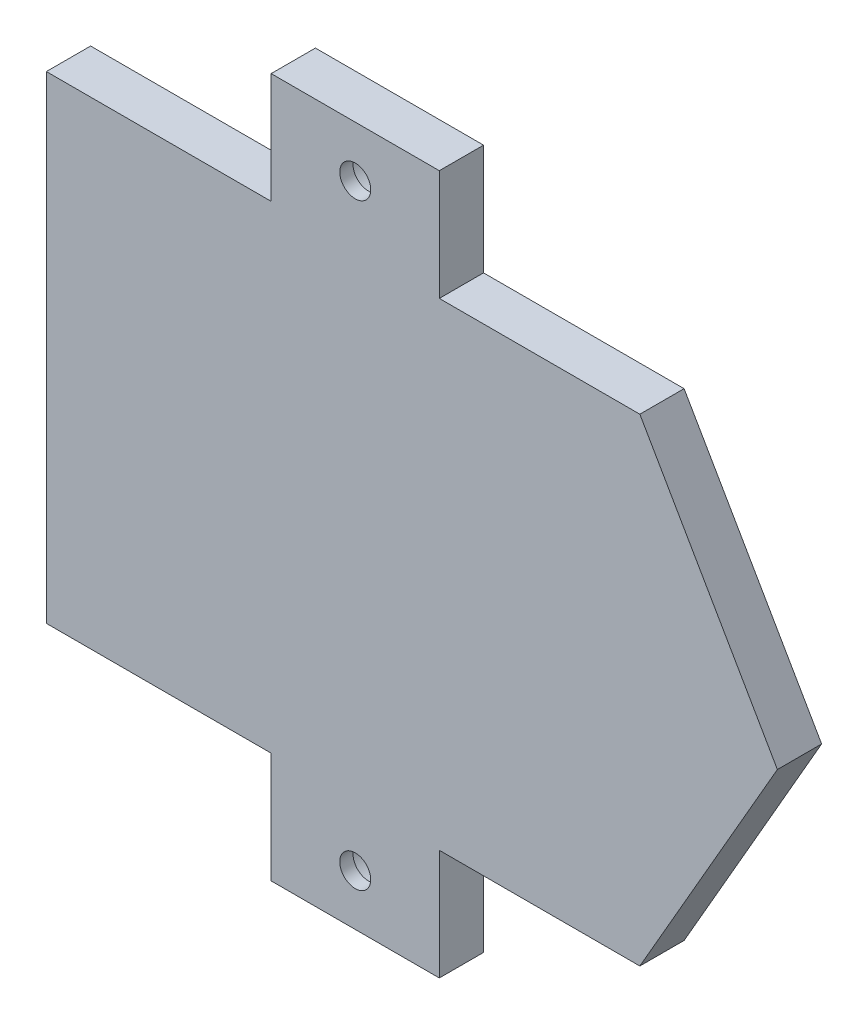
ISO-10303-21;
HEADER;
FILE_DESCRIPTION(('STEP AP214'),'2;1');
FILE_NAME('part.step','',(''),(''),'','','');
FILE_SCHEMA(('AUTOMOTIVE_DESIGN { 1 0 10303 214 1 1 1 1 }'));
ENDSEC;
DATA;
#1=APPLICATION_CONTEXT('core data for automotive mechanical design processes');
#2=APPLICATION_PROTOCOL_DEFINITION('international standard','automotive_design',2000,#1);
#3=PRODUCT_CONTEXT('',#1,'mechanical');
#4=PRODUCT('Part','Part','',(#3));
#5=PRODUCT_RELATED_PRODUCT_CATEGORY('part','',(#4));
#6=PRODUCT_DEFINITION_FORMATION('','',#4);
#7=PRODUCT_DEFINITION_CONTEXT('part definition',#1,'design');
#8=PRODUCT_DEFINITION('design','',#6,#7);
#9=PRODUCT_DEFINITION_SHAPE('','',#8);
#10=(LENGTH_UNIT() NAMED_UNIT(*) SI_UNIT(.MILLI.,.METRE.));
#11=(NAMED_UNIT(*) PLANE_ANGLE_UNIT() SI_UNIT($,.RADIAN.));
#12=(NAMED_UNIT(*) SI_UNIT($,.STERADIAN.) SOLID_ANGLE_UNIT());
#13=UNCERTAINTY_MEASURE_WITH_UNIT(LENGTH_MEASURE(1.E-05),#10,'distance_accuracy_value','');
#14=(GEOMETRIC_REPRESENTATION_CONTEXT(3) GLOBAL_UNCERTAINTY_ASSIGNED_CONTEXT((#13)) GLOBAL_UNIT_ASSIGNED_CONTEXT((#10,
#11,#12)) REPRESENTATION_CONTEXT('',''));
#15=CARTESIAN_POINT('',(0.,0.,0.));
#16=DIRECTION('',(0.,0.,1.));
#17=DIRECTION('',(1.,0.,0.));
#18=AXIS2_PLACEMENT_3D('',#15,#16,#17);
#19=CARTESIAN_POINT('',(0.,0.,0.));
#20=DIRECTION('',(0.,0.,1.));
#21=DIRECTION('',(1.,0.,0.));
#22=AXIS2_PLACEMENT_3D('',#19,#20,#21);
#23=PLANE('',#22);
#24=CARTESIAN_POINT('',(45.4000000000162,83.7499999999994,0.));
#25=DIRECTION('',(0.,0.,1.));
#26=DIRECTION('',(1.,0.,0.));
#27=AXIS2_PLACEMENT_3D('',#24,#25,#26);
#28=CIRCLE('',#27,3.5);
#29=CARTESIAN_POINT('',(41.9000000000162,83.7499999999994,0.));
#30=VERTEX_POINT('',#29);
#31=EDGE_CURVE('E294',#30,#30,#28,.T.);
#32=ORIENTED_EDGE('',*,*,#31,.T.);
#33=EDGE_LOOP('',(#32));
#34=FACE_BOUND('',#33,.T.);
#35=CARTESIAN_POINT('',(45.4000000000162,16.2500000000233,0.));
#36=DIRECTION('',(0.,0.,1.));
#37=DIRECTION('',(1.,0.,0.));
#38=AXIS2_PLACEMENT_3D('',#35,#36,#37);
#39=CIRCLE('',#38,3.5);
#40=CARTESIAN_POINT('',(41.9000000000162,16.2500000000233,0.));
#41=VERTEX_POINT('',#40);
#42=EDGE_CURVE('E297',#41,#41,#39,.T.);
#43=ORIENTED_EDGE('',*,*,#42,.T.);
#44=EDGE_LOOP('',(#43));
#45=FACE_BOUND('',#44,.T.);
#46=DIRECTION('',(1.,0.,0.));
#47=VECTOR('',#46,1.);
#48=CARTESIAN_POINT('',(0.,23.0000000000114,0.));
#49=LINE('',#48,#47);
#50=CARTESIAN_POINT('',(54.9000000000161,23.0000000000114,0.));
#51=VERTEX_POINT('',#50);
#52=CARTESIAN_POINT('',(77.5584398169608,23.0000000000114,0.));
#53=VERTEX_POINT('',#52);
#54=EDGE_CURVE('E146',#51,#53,#49,.T.);
#55=ORIENTED_EDGE('',*,*,#54,.F.);
#56=DIRECTION('',(0.,1.,0.));
#57=VECTOR('',#56,1.);
#58=CARTESIAN_POINT('',(54.9000000000162,1.52378110130139E-13,0.));
#59=LINE('',#58,#57);
#60=CARTESIAN_POINT('',(54.9000000000162,10.5000000000352,0.));
#61=VERTEX_POINT('',#60);
#62=EDGE_CURVE('E60',#61,#51,#59,.T.);
#63=ORIENTED_EDGE('',*,*,#62,.F.);
#64=DIRECTION('',(1.,0.,0.));
#65=VECTOR('',#64,1.);
#66=CARTESIAN_POINT('',(0.,10.5000000000352,0.));
#67=LINE('',#66,#65);
#68=CARTESIAN_POINT('',(35.9000000000162,10.5000000000352,0.));
#69=VERTEX_POINT('',#68);
#70=EDGE_CURVE('E138',#69,#61,#67,.T.);
#71=ORIENTED_EDGE('',*,*,#70,.F.);
#72=DIRECTION('',(0.,-1.,0.));
#73=VECTOR('',#72,1.);
#74=CARTESIAN_POINT('',(35.9000000000162,0.,0.));
#75=LINE('',#74,#73);
#76=CARTESIAN_POINT('',(35.9000000000162,23.0000000000114,0.));
#77=VERTEX_POINT('',#76);
#78=EDGE_CURVE('E185',#77,#69,#75,.T.);
#79=ORIENTED_EDGE('',*,*,#78,.F.);
#80=DIRECTION('',(1.,0.,0.));
#81=VECTOR('',#80,1.);
#82=CARTESIAN_POINT('',(0.,23.0000000000114,0.));
#83=LINE('',#82,#81);
#84=CARTESIAN_POINT('',(10.5000000000162,23.0000000000114,0.));
#85=VERTEX_POINT('',#84);
#86=EDGE_CURVE('E188',#85,#77,#83,.T.);
#87=ORIENTED_EDGE('',*,*,#86,.F.);
#88=DIRECTION('',(0.,-1.,0.));
#89=VECTOR('',#88,1.);
#90=CARTESIAN_POINT('',(10.5000000000162,0.,0.));
#91=LINE('',#90,#89);
#92=CARTESIAN_POINT('',(10.5000000000162,77.0000000000114,0.));
#93=VERTEX_POINT('',#92);
#94=EDGE_CURVE('E191',#93,#85,#91,.T.);
#95=ORIENTED_EDGE('',*,*,#94,.F.);
#96=DIRECTION('',(-1.,0.,0.));
#97=VECTOR('',#96,1.);
#98=CARTESIAN_POINT('',(0.,77.0000000000114,0.));
#99=LINE('',#98,#97);
#100=CARTESIAN_POINT('',(35.9000000000162,77.0000000000114,0.));
#101=VERTEX_POINT('',#100);
#102=EDGE_CURVE('E194',#101,#93,#99,.T.);
#103=ORIENTED_EDGE('',*,*,#102,.F.);
#104=DIRECTION('',(0.,-1.,0.));
#105=VECTOR('',#104,1.);
#106=CARTESIAN_POINT('',(35.9000000000163,0.,0.));
#107=LINE('',#106,#105);
#108=CARTESIAN_POINT('',(35.9000000000162,89.4999999999875,0.));
#109=VERTEX_POINT('',#108);
#110=EDGE_CURVE('E197',#109,#101,#107,.T.);
#111=ORIENTED_EDGE('',*,*,#110,.F.);
#112=DIRECTION('',(-1.,0.,0.));
#113=VECTOR('',#112,1.);
#114=CARTESIAN_POINT('',(0.,89.4999999999875,0.));
#115=LINE('',#114,#113);
#116=CARTESIAN_POINT('',(54.9000000000161,89.4999999999875,0.));
#117=VERTEX_POINT('',#116);
#118=EDGE_CURVE('E200',#117,#109,#115,.T.);
#119=ORIENTED_EDGE('',*,*,#118,.F.);
#120=DIRECTION('',(0.,1.,0.));
#121=VECTOR('',#120,1.);
#122=CARTESIAN_POINT('',(54.9000000000161,0.,0.));
#123=LINE('',#122,#121);
#124=CARTESIAN_POINT('',(54.9000000000161,77.0000000000114,0.));
#125=VERTEX_POINT('',#124);
#126=EDGE_CURVE('E203',#125,#117,#123,.T.);
#127=ORIENTED_EDGE('',*,*,#126,.F.);
#128=DIRECTION('',(-1.,0.,0.));
#129=VECTOR('',#128,1.);
#130=CARTESIAN_POINT('',(0.,77.0000000000114,0.));
#131=LINE('',#130,#129);
#132=CARTESIAN_POINT('',(77.5584398169608,77.0000000000114,0.));
#133=VERTEX_POINT('',#132);
#134=EDGE_CURVE('E206',#133,#125,#131,.T.);
#135=ORIENTED_EDGE('',*,*,#134,.F.);
#136=DIRECTION('',(-0.498868225243293,0.86667784893962,0.));
#137=VECTOR('',#136,1.);
#138=CARTESIAN_POINT('',(91.5480783089609,52.6959670266213,0.));
#139=LINE('',#138,#137);
#140=CARTESIAN_POINT('',(93.0999032315949,50.0000000000114,0.));
#141=VERTEX_POINT('',#140);
#142=EDGE_CURVE('E209',#141,#133,#139,.T.);
#143=ORIENTED_EDGE('',*,*,#142,.F.);
#144=DIRECTION('',(0.498868225243293,0.86667784893962,0.));
#145=VECTOR('',#144,1.);
#146=CARTESIAN_POINT('',(48.3122742731328,-27.8090164108764,0.));
#147=LINE('',#146,#145);
#148=EDGE_CURVE('E212',#53,#141,#147,.T.);
#149=ORIENTED_EDGE('',*,*,#148,.F.);
#150=EDGE_LOOP('',(#55,#63,#71,#79,#87,#95,#103,#111,#119,#127,#135,#143,#149));
#151=FACE_BOUND('',#150,.T.);
#152=ADVANCED_FACE('F39',(#34,#45,#151),#23,.F.);
#153=CARTESIAN_POINT('',(54.9000000000162,1.52378110130139E-13,5.));
#154=DIRECTION('',(-1.,0.,0.));
#155=DIRECTION('',(0.,-1.,0.));
#156=AXIS2_PLACEMENT_3D('',#153,#154,#155);
#157=PLANE('',#156);
#158=ORIENTED_EDGE('',*,*,#62,.T.);
#159=DIRECTION('',(0.,0.,-1.));
#160=VECTOR('',#159,1.);
#161=CARTESIAN_POINT('',(54.9000000000161,23.0000000000114,5.));
#162=LINE('',#161,#160);
#163=CARTESIAN_POINT('',(54.9000000000161,23.0000000000114,5.));
#164=VERTEX_POINT('',#163);
#165=EDGE_CURVE('E142',#164,#51,#162,.T.);
#166=ORIENTED_EDGE('',*,*,#165,.F.);
#167=DIRECTION('',(0.,1.,0.));
#168=VECTOR('',#167,1.);
#169=CARTESIAN_POINT('',(54.9000000000162,1.52378110130139E-13,5.));
#170=LINE('',#169,#168);
#171=CARTESIAN_POINT('',(54.9000000000162,10.5000000000352,5.));
#172=VERTEX_POINT('',#171);
#173=EDGE_CURVE('E140',#172,#164,#170,.T.);
#174=ORIENTED_EDGE('',*,*,#173,.F.);
#175=DIRECTION('',(0.,0.,-1.));
#176=VECTOR('',#175,1.);
#177=CARTESIAN_POINT('',(54.9000000000162,10.5000000000352,5.));
#178=LINE('',#177,#176);
#179=EDGE_CURVE('E11',#172,#61,#178,.T.);
#180=ORIENTED_EDGE('',*,*,#179,.T.);
#181=EDGE_LOOP('',(#158,#166,#174,#180));
#182=FACE_BOUND('',#181,.T.);
#183=ADVANCED_FACE('F141',(#182),#157,.F.);
#184=CARTESIAN_POINT('',(0.,10.5000000000352,5.));
#185=DIRECTION('',(0.,1.,0.));
#186=DIRECTION('',(0.,0.,1.));
#187=AXIS2_PLACEMENT_3D('',#184,#185,#186);
#188=PLANE('',#187);
#189=ORIENTED_EDGE('',*,*,#70,.T.);
#190=ORIENTED_EDGE('',*,*,#179,.F.);
#191=DIRECTION('',(1.,0.,0.));
#192=VECTOR('',#191,1.);
#193=CARTESIAN_POINT('',(0.,10.5000000000352,5.));
#194=LINE('',#193,#192);
#195=CARTESIAN_POINT('',(35.9000000000162,10.5000000000352,5.));
#196=VERTEX_POINT('',#195);
#197=EDGE_CURVE('E135',#196,#172,#194,.T.);
#198=ORIENTED_EDGE('',*,*,#197,.F.);
#199=DIRECTION('',(0.,0.,-1.));
#200=VECTOR('',#199,1.);
#201=CARTESIAN_POINT('',(35.9000000000162,10.5000000000352,5.));
#202=LINE('',#201,#200);
#203=EDGE_CURVE('E46',#196,#69,#202,.T.);
#204=ORIENTED_EDGE('',*,*,#203,.T.);
#205=EDGE_LOOP('',(#189,#190,#198,#204));
#206=FACE_BOUND('',#205,.T.);
#207=ADVANCED_FACE('F133',(#206),#188,.F.);
#208=CARTESIAN_POINT('',(35.9000000000162,0.,5.));
#209=DIRECTION('',(1.,0.,0.));
#210=DIRECTION('',(0.,1.,0.));
#211=AXIS2_PLACEMENT_3D('',#208,#209,#210);
#212=PLANE('',#211);
#213=ORIENTED_EDGE('',*,*,#78,.T.);
#214=ORIENTED_EDGE('',*,*,#203,.F.);
#215=DIRECTION('',(0.,-1.,0.));
#216=VECTOR('',#215,1.);
#217=CARTESIAN_POINT('',(35.9000000000162,0.,5.));
#218=LINE('',#217,#216);
#219=CARTESIAN_POINT('',(35.9000000000162,23.0000000000114,5.));
#220=VERTEX_POINT('',#219);
#221=EDGE_CURVE('E151',#220,#196,#218,.T.);
#222=ORIENTED_EDGE('',*,*,#221,.F.);
#223=DIRECTION('',(0.,0.,-1.));
#224=VECTOR('',#223,1.);
#225=CARTESIAN_POINT('',(35.9000000000162,23.0000000000114,5.));
#226=LINE('',#225,#224);
#227=EDGE_CURVE('E236',#220,#77,#226,.T.);
#228=ORIENTED_EDGE('',*,*,#227,.T.);
#229=EDGE_LOOP('',(#213,#214,#222,#228));
#230=FACE_BOUND('',#229,.T.);
#231=ADVANCED_FACE('F239',(#230),#212,.F.);
#232=CARTESIAN_POINT('',(0.,23.0000000000114,5.));
#233=DIRECTION('',(0.,1.,0.));
#234=DIRECTION('',(0.,0.,1.));
#235=AXIS2_PLACEMENT_3D('',#232,#233,#234);
#236=PLANE('',#235);
#237=ORIENTED_EDGE('',*,*,#86,.T.);
#238=ORIENTED_EDGE('',*,*,#227,.F.);
#239=DIRECTION('',(1.,0.,0.));
#240=VECTOR('',#239,1.);
#241=CARTESIAN_POINT('',(0.,23.0000000000114,5.));
#242=LINE('',#241,#240);
#243=CARTESIAN_POINT('',(10.5000000000162,23.0000000000114,5.));
#244=VERTEX_POINT('',#243);
#245=EDGE_CURVE('E153',#244,#220,#242,.T.);
#246=ORIENTED_EDGE('',*,*,#245,.F.);
#247=DIRECTION('',(0.,0.,-1.));
#248=VECTOR('',#247,1.);
#249=CARTESIAN_POINT('',(10.5000000000162,23.0000000000114,5.));
#250=LINE('',#249,#248);
#251=EDGE_CURVE('E234',#244,#85,#250,.T.);
#252=ORIENTED_EDGE('',*,*,#251,.T.);
#253=EDGE_LOOP('',(#237,#238,#246,#252));
#254=FACE_BOUND('',#253,.T.);
#255=ADVANCED_FACE('F276',(#254),#236,.F.);
#256=CARTESIAN_POINT('',(10.5000000000162,0.,5.));
#257=DIRECTION('',(1.,0.,0.));
#258=DIRECTION('',(0.,1.,0.));
#259=AXIS2_PLACEMENT_3D('',#256,#257,#258);
#260=PLANE('',#259);
#261=ORIENTED_EDGE('',*,*,#94,.T.);
#262=ORIENTED_EDGE('',*,*,#251,.F.);
#263=DIRECTION('',(0.,-1.,0.));
#264=VECTOR('',#263,1.);
#265=CARTESIAN_POINT('',(10.5000000000162,0.,5.));
#266=LINE('',#265,#264);
#267=CARTESIAN_POINT('',(10.5000000000162,77.0000000000114,5.));
#268=VERTEX_POINT('',#267);
#269=EDGE_CURVE('E158',#268,#244,#266,.T.);
#270=ORIENTED_EDGE('',*,*,#269,.F.);
#271=DIRECTION('',(0.,0.,-1.));
#272=VECTOR('',#271,1.);
#273=CARTESIAN_POINT('',(10.5000000000162,77.0000000000114,5.));
#274=LINE('',#273,#272);
#275=EDGE_CURVE('E232',#268,#93,#274,.T.);
#276=ORIENTED_EDGE('',*,*,#275,.T.);
#277=EDGE_LOOP('',(#261,#262,#270,#276));
#278=FACE_BOUND('',#277,.T.);
#279=ADVANCED_FACE('F273',(#278),#260,.F.);
#280=CARTESIAN_POINT('',(0.,77.0000000000114,5.));
#281=DIRECTION('',(0.,-1.,0.));
#282=DIRECTION('',(0.,0.,-1.));
#283=AXIS2_PLACEMENT_3D('',#280,#281,#282);
#284=PLANE('',#283);
#285=ORIENTED_EDGE('',*,*,#102,.T.);
#286=ORIENTED_EDGE('',*,*,#275,.F.);
#287=DIRECTION('',(-1.,0.,0.));
#288=VECTOR('',#287,1.);
#289=CARTESIAN_POINT('',(0.,77.0000000000114,5.));
#290=LINE('',#289,#288);
#291=CARTESIAN_POINT('',(35.9000000000162,77.0000000000114,5.));
#292=VERTEX_POINT('',#291);
#293=EDGE_CURVE('E161',#292,#268,#290,.T.);
#294=ORIENTED_EDGE('',*,*,#293,.F.);
#295=DIRECTION('',(0.,0.,-1.));
#296=VECTOR('',#295,1.);
#297=CARTESIAN_POINT('',(35.9000000000162,77.0000000000114,5.));
#298=LINE('',#297,#296);
#299=EDGE_CURVE('E230',#292,#101,#298,.T.);
#300=ORIENTED_EDGE('',*,*,#299,.T.);
#301=EDGE_LOOP('',(#285,#286,#294,#300));
#302=FACE_BOUND('',#301,.T.);
#303=ADVANCED_FACE('F269',(#302),#284,.F.);
#304=CARTESIAN_POINT('',(35.9000000000163,0.,5.));
#305=DIRECTION('',(1.,0.,0.));
#306=DIRECTION('',(0.,1.,0.));
#307=AXIS2_PLACEMENT_3D('',#304,#305,#306);
#308=PLANE('',#307);
#309=ORIENTED_EDGE('',*,*,#110,.T.);
#310=ORIENTED_EDGE('',*,*,#299,.F.);
#311=DIRECTION('',(0.,-1.,0.));
#312=VECTOR('',#311,1.);
#313=CARTESIAN_POINT('',(35.9000000000163,0.,5.));
#314=LINE('',#313,#312);
#315=CARTESIAN_POINT('',(35.9000000000162,89.4999999999875,5.));
#316=VERTEX_POINT('',#315);
#317=EDGE_CURVE('E164',#316,#292,#314,.T.);
#318=ORIENTED_EDGE('',*,*,#317,.F.);
#319=DIRECTION('',(0.,0.,-1.));
#320=VECTOR('',#319,1.);
#321=CARTESIAN_POINT('',(35.9000000000162,89.4999999999875,5.));
#322=LINE('',#321,#320);
#323=EDGE_CURVE('E228',#316,#109,#322,.T.);
#324=ORIENTED_EDGE('',*,*,#323,.T.);
#325=EDGE_LOOP('',(#309,#310,#318,#324));
#326=FACE_BOUND('',#325,.T.);
#327=ADVANCED_FACE('F265',(#326),#308,.F.);
#328=CARTESIAN_POINT('',(0.,89.4999999999875,5.));
#329=DIRECTION('',(0.,-1.,0.));
#330=DIRECTION('',(0.,0.,-1.));
#331=AXIS2_PLACEMENT_3D('',#328,#329,#330);
#332=PLANE('',#331);
#333=ORIENTED_EDGE('',*,*,#118,.T.);
#334=ORIENTED_EDGE('',*,*,#323,.F.);
#335=DIRECTION('',(-1.,0.,0.));
#336=VECTOR('',#335,1.);
#337=CARTESIAN_POINT('',(0.,89.4999999999875,5.));
#338=LINE('',#337,#336);
#339=CARTESIAN_POINT('',(54.9000000000161,89.4999999999875,5.));
#340=VERTEX_POINT('',#339);
#341=EDGE_CURVE('E167',#340,#316,#338,.T.);
#342=ORIENTED_EDGE('',*,*,#341,.F.);
#343=DIRECTION('',(0.,0.,-1.));
#344=VECTOR('',#343,1.);
#345=CARTESIAN_POINT('',(54.9000000000161,89.4999999999875,5.));
#346=LINE('',#345,#344);
#347=EDGE_CURVE('E226',#340,#117,#346,.T.);
#348=ORIENTED_EDGE('',*,*,#347,.T.);
#349=EDGE_LOOP('',(#333,#334,#342,#348));
#350=FACE_BOUND('',#349,.T.);
#351=ADVANCED_FACE('F261',(#350),#332,.F.);
#352=CARTESIAN_POINT('',(54.9000000000161,0.,5.));
#353=DIRECTION('',(-1.,0.,0.));
#354=DIRECTION('',(0.,-1.,0.));
#355=AXIS2_PLACEMENT_3D('',#352,#353,#354);
#356=PLANE('',#355);
#357=ORIENTED_EDGE('',*,*,#126,.T.);
#358=ORIENTED_EDGE('',*,*,#347,.F.);
#359=DIRECTION('',(0.,1.,0.));
#360=VECTOR('',#359,1.);
#361=CARTESIAN_POINT('',(54.9000000000161,0.,5.));
#362=LINE('',#361,#360);
#363=CARTESIAN_POINT('',(54.9000000000161,77.0000000000114,5.));
#364=VERTEX_POINT('',#363);
#365=EDGE_CURVE('E170',#364,#340,#362,.T.);
#366=ORIENTED_EDGE('',*,*,#365,.F.);
#367=DIRECTION('',(0.,0.,-1.));
#368=VECTOR('',#367,1.);
#369=CARTESIAN_POINT('',(54.9000000000161,77.0000000000114,5.));
#370=LINE('',#369,#368);
#371=EDGE_CURVE('E224',#364,#125,#370,.T.);
#372=ORIENTED_EDGE('',*,*,#371,.T.);
#373=EDGE_LOOP('',(#357,#358,#366,#372));
#374=FACE_BOUND('',#373,.T.);
#375=ADVANCED_FACE('F257',(#374),#356,.F.);
#376=CARTESIAN_POINT('',(0.,77.0000000000114,5.));
#377=DIRECTION('',(0.,-1.,0.));
#378=DIRECTION('',(0.,0.,-1.));
#379=AXIS2_PLACEMENT_3D('',#376,#377,#378);
#380=PLANE('',#379);
#381=ORIENTED_EDGE('',*,*,#134,.T.);
#382=ORIENTED_EDGE('',*,*,#371,.F.);
#383=DIRECTION('',(-1.,0.,0.));
#384=VECTOR('',#383,1.);
#385=CARTESIAN_POINT('',(0.,77.0000000000114,5.));
#386=LINE('',#385,#384);
#387=CARTESIAN_POINT('',(77.5584398169608,77.0000000000114,5.));
#388=VERTEX_POINT('',#387);
#389=EDGE_CURVE('E173',#388,#364,#386,.T.);
#390=ORIENTED_EDGE('',*,*,#389,.F.);
#391=DIRECTION('',(0.,0.,-1.));
#392=VECTOR('',#391,1.);
#393=CARTESIAN_POINT('',(77.5584398169608,77.0000000000114,5.));
#394=LINE('',#393,#392);
#395=EDGE_CURVE('E222',#388,#133,#394,.T.);
#396=ORIENTED_EDGE('',*,*,#395,.T.);
#397=EDGE_LOOP('',(#381,#382,#390,#396));
#398=FACE_BOUND('',#397,.T.);
#399=ADVANCED_FACE('F253',(#398),#380,.F.);
#400=CARTESIAN_POINT('',(91.5480783089609,52.6959670266213,5.));
#401=DIRECTION('',(-0.86667784893962,-0.498868225243293,0.));
#402=DIRECTION('',(0.498868225243293,-0.86667784893962,0.));
#403=AXIS2_PLACEMENT_3D('',#400,#401,#402);
#404=PLANE('',#403);
#405=ORIENTED_EDGE('',*,*,#142,.T.);
#406=ORIENTED_EDGE('',*,*,#395,.F.);
#407=DIRECTION('',(-0.498868225243293,0.86667784893962,0.));
#408=VECTOR('',#407,1.);
#409=CARTESIAN_POINT('',(91.5480783089609,52.6959670266213,5.));
#410=LINE('',#409,#408);
#411=CARTESIAN_POINT('',(93.0999032315949,50.0000000000114,5.));
#412=VERTEX_POINT('',#411);
#413=EDGE_CURVE('E176',#412,#388,#410,.T.);
#414=ORIENTED_EDGE('',*,*,#413,.F.);
#415=DIRECTION('',(0.,0.,-1.));
#416=VECTOR('',#415,1.);
#417=CARTESIAN_POINT('',(93.0999032315949,50.0000000000114,5.));
#418=LINE('',#417,#416);
#419=EDGE_CURVE('E220',#412,#141,#418,.T.);
#420=ORIENTED_EDGE('',*,*,#419,.T.);
#421=EDGE_LOOP('',(#405,#406,#414,#420));
#422=FACE_BOUND('',#421,.T.);
#423=ADVANCED_FACE('F250',(#422),#404,.F.);
#424=CARTESIAN_POINT('',(48.3122742731328,-27.8090164108764,5.));
#425=DIRECTION('',(-0.86667784893962,0.498868225243293,0.));
#426=DIRECTION('',(-0.498868225243293,-0.86667784893962,0.));
#427=AXIS2_PLACEMENT_3D('',#424,#425,#426);
#428=PLANE('',#427);
#429=ORIENTED_EDGE('',*,*,#148,.T.);
#430=ORIENTED_EDGE('',*,*,#419,.F.);
#431=DIRECTION('',(0.498868225243293,0.86667784893962,0.));
#432=VECTOR('',#431,1.);
#433=CARTESIAN_POINT('',(48.3122742731328,-27.8090164108764,5.));
#434=LINE('',#433,#432);
#435=CARTESIAN_POINT('',(77.5584398169608,23.0000000000114,5.));
#436=VERTEX_POINT('',#435);
#437=EDGE_CURVE('E53',#436,#412,#434,.T.);
#438=ORIENTED_EDGE('',*,*,#437,.F.);
#439=DIRECTION('',(0.,0.,-1.));
#440=VECTOR('',#439,1.);
#441=CARTESIAN_POINT('',(77.5584398169608,23.0000000000114,5.));
#442=LINE('',#441,#440);
#443=EDGE_CURVE('E218',#436,#53,#442,.T.);
#444=ORIENTED_EDGE('',*,*,#443,.T.);
#445=EDGE_LOOP('',(#429,#430,#438,#444));
#446=FACE_BOUND('',#445,.T.);
#447=ADVANCED_FACE('F348',(#446),#428,.F.);
#448=CARTESIAN_POINT('',(0.,23.0000000000114,5.));
#449=DIRECTION('',(0.,1.,0.));
#450=DIRECTION('',(-1.,0.,0.));
#451=AXIS2_PLACEMENT_3D('',#448,#449,#450);
#452=PLANE('',#451);
#453=ORIENTED_EDGE('',*,*,#54,.T.);
#454=ORIENTED_EDGE('',*,*,#443,.F.);
#455=DIRECTION('',(1.,0.,0.));
#456=VECTOR('',#455,1.);
#457=CARTESIAN_POINT('',(0.,23.0000000000114,5.));
#458=LINE('',#457,#456);
#459=EDGE_CURVE('E180',#164,#436,#458,.T.);
#460=ORIENTED_EDGE('',*,*,#459,.F.);
#461=ORIENTED_EDGE('',*,*,#165,.T.);
#462=EDGE_LOOP('',(#453,#454,#460,#461));
#463=FACE_BOUND('',#462,.T.);
#464=ADVANCED_FACE('F246',(#463),#452,.F.);
#465=CARTESIAN_POINT('',(0.,0.,5.));
#466=DIRECTION('',(0.,0.,1.));
#467=DIRECTION('',(1.,0.,0.));
#468=AXIS2_PLACEMENT_3D('',#465,#466,#467);
#469=PLANE('',#468);
#470=CARTESIAN_POINT('',(45.4000000000162,83.7499999999994,5.));
#471=DIRECTION('',(0.,0.,1.));
#472=DIRECTION('',(1.,0.,0.));
#473=AXIS2_PLACEMENT_3D('',#470,#471,#472);
#474=CIRCLE('',#473,1.75);
#475=CARTESIAN_POINT('',(47.1500000000162,83.7499999999994,5.));
#476=VERTEX_POINT('',#475);
#477=EDGE_CURVE('E183',#476,#476,#474,.T.);
#478=ORIENTED_EDGE('',*,*,#477,.F.);
#479=EDGE_LOOP('',(#478));
#480=FACE_BOUND('',#479,.T.);
#481=CARTESIAN_POINT('',(45.4000000000162,16.2500000000233,5.));
#482=DIRECTION('',(0.,0.,1.));
#483=DIRECTION('',(1.,0.,0.));
#484=AXIS2_PLACEMENT_3D('',#481,#482,#483);
#485=CIRCLE('',#484,1.75);
#486=CARTESIAN_POINT('',(47.1500000000162,16.2500000000233,5.));
#487=VERTEX_POINT('',#486);
#488=EDGE_CURVE('E307',#487,#487,#485,.T.);
#489=ORIENTED_EDGE('',*,*,#488,.F.);
#490=EDGE_LOOP('',(#489));
#491=FACE_BOUND('',#490,.T.);
#492=ORIENTED_EDGE('',*,*,#173,.T.);
#493=ORIENTED_EDGE('',*,*,#459,.T.);
#494=ORIENTED_EDGE('',*,*,#437,.T.);
#495=ORIENTED_EDGE('',*,*,#413,.T.);
#496=ORIENTED_EDGE('',*,*,#389,.T.);
#497=ORIENTED_EDGE('',*,*,#365,.T.);
#498=ORIENTED_EDGE('',*,*,#341,.T.);
#499=ORIENTED_EDGE('',*,*,#317,.T.);
#500=ORIENTED_EDGE('',*,*,#293,.T.);
#501=ORIENTED_EDGE('',*,*,#269,.T.);
#502=ORIENTED_EDGE('',*,*,#245,.T.);
#503=ORIENTED_EDGE('',*,*,#221,.T.);
#504=ORIENTED_EDGE('',*,*,#197,.T.);
#505=EDGE_LOOP('',(#492,#493,#494,#495,#496,#497,#498,#499,#500,#501,#502,#503,#504));
#506=FACE_BOUND('',#505,.T.);
#507=ADVANCED_FACE('F148',(#480,#491,#506),#469,.T.);
#508=CARTESIAN_POINT('',(45.4000000000162,16.2500000000233,-1.2E-05));
#509=DIRECTION('',(0.,0.,1.));
#510=DIRECTION('',(1.,0.,0.));
#511=AXIS2_PLACEMENT_3D('',#508,#509,#510);
#512=CYLINDRICAL_SURFACE('',#511,1.75);
#513=CARTESIAN_POINT('',(45.4000000000162,16.2500000000233,3.5));
#514=DIRECTION('',(0.,0.,1.));
#515=DIRECTION('',(1.,0.,0.));
#516=AXIS2_PLACEMENT_3D('',#513,#514,#515);
#517=CIRCLE('',#516,1.75);
#518=CARTESIAN_POINT('',(47.1500000000162,16.2500000000233,3.5));
#519=VERTEX_POINT('',#518);
#520=EDGE_CURVE('E299',#519,#519,#517,.T.);
#521=CARTESIAN_POINT('',(47.1500000000162,16.2500000000233,3.5));
#522=CARTESIAN_POINT('',(47.1500000000162,16.2500000000233,3.515625));
#523=CARTESIAN_POINT('',(47.1500000000162,16.2500000000233,3.53125));
#524=CARTESIAN_POINT('',(47.1500000000162,16.2500000000233,3.5625));
#525=CARTESIAN_POINT('',(47.1500000000162,16.2500000000233,3.578125));
#526=CARTESIAN_POINT('',(47.1500000000162,16.2500000000233,3.609375));
#527=CARTESIAN_POINT('',(47.1500000000162,16.2500000000233,3.625));
#528=CARTESIAN_POINT('',(47.1500000000162,16.2500000000233,3.65625));
#529=CARTESIAN_POINT('',(47.1500000000162,16.2500000000233,3.671875));
#530=CARTESIAN_POINT('',(47.1500000000162,16.2500000000233,3.703125));
#531=CARTESIAN_POINT('',(47.1500000000162,16.2500000000233,3.71875));
#532=CARTESIAN_POINT('',(47.1500000000162,16.2500000000233,3.75));
#533=CARTESIAN_POINT('',(47.1500000000162,16.2500000000233,3.765625));
#534=CARTESIAN_POINT('',(47.1500000000162,16.2500000000233,3.796875));
#535=CARTESIAN_POINT('',(47.1500000000162,16.2500000000233,3.8125));
#536=CARTESIAN_POINT('',(47.1500000000162,16.2500000000233,3.84375));
#537=CARTESIAN_POINT('',(47.1500000000162,16.2500000000233,3.859375));
#538=CARTESIAN_POINT('',(47.1500000000162,16.2500000000233,3.890625));
#539=CARTESIAN_POINT('',(47.1500000000162,16.2500000000233,3.90625));
#540=CARTESIAN_POINT('',(47.1500000000162,16.2500000000233,3.9375));
#541=CARTESIAN_POINT('',(47.1500000000162,16.2500000000233,3.953125));
#542=CARTESIAN_POINT('',(47.1500000000162,16.2500000000233,3.984375));
#543=CARTESIAN_POINT('',(47.1500000000162,16.2500000000233,4.));
#544=CARTESIAN_POINT('',(47.1500000000162,16.2500000000233,4.03125));
#545=CARTESIAN_POINT('',(47.1500000000162,16.2500000000233,4.046875));
#546=CARTESIAN_POINT('',(47.1500000000162,16.2500000000233,4.078125));
#547=CARTESIAN_POINT('',(47.1500000000162,16.2500000000233,4.09375));
#548=CARTESIAN_POINT('',(47.1500000000162,16.2500000000233,4.125));
#549=CARTESIAN_POINT('',(47.1500000000162,16.2500000000233,4.140625));
#550=CARTESIAN_POINT('',(47.1500000000162,16.2500000000233,4.171875));
#551=CARTESIAN_POINT('',(47.1500000000162,16.2500000000233,4.1875));
#552=CARTESIAN_POINT('',(47.1500000000162,16.2500000000233,4.21875));
#553=CARTESIAN_POINT('',(47.1500000000162,16.2500000000233,4.234375));
#554=CARTESIAN_POINT('',(47.1500000000162,16.2500000000233,4.265625));
#555=CARTESIAN_POINT('',(47.1500000000162,16.2500000000233,4.28125));
#556=CARTESIAN_POINT('',(47.1500000000162,16.2500000000233,4.3125));
#557=CARTESIAN_POINT('',(47.1500000000162,16.2500000000233,4.328125));
#558=CARTESIAN_POINT('',(47.1500000000162,16.2500000000233,4.359375));
#559=CARTESIAN_POINT('',(47.1500000000162,16.2500000000233,4.375));
#560=CARTESIAN_POINT('',(47.1500000000162,16.2500000000233,4.40625));
#561=CARTESIAN_POINT('',(47.1500000000162,16.2500000000233,4.421875));
#562=CARTESIAN_POINT('',(47.1500000000162,16.2500000000233,4.453125));
#563=CARTESIAN_POINT('',(47.1500000000162,16.2500000000233,4.46875));
#564=CARTESIAN_POINT('',(47.1500000000162,16.2500000000233,4.5));
#565=CARTESIAN_POINT('',(47.1500000000162,16.2500000000233,4.515625));
#566=CARTESIAN_POINT('',(47.1500000000162,16.2500000000233,4.546875));
#567=CARTESIAN_POINT('',(47.1500000000162,16.2500000000233,4.5625));
#568=CARTESIAN_POINT('',(47.1500000000162,16.2500000000233,4.59375));
#569=CARTESIAN_POINT('',(47.1500000000162,16.2500000000233,4.609375));
#570=CARTESIAN_POINT('',(47.1500000000162,16.2500000000233,4.640625));
#571=CARTESIAN_POINT('',(47.1500000000162,16.2500000000233,4.65625));
#572=CARTESIAN_POINT('',(47.1500000000162,16.2500000000233,4.6875));
#573=CARTESIAN_POINT('',(47.1500000000162,16.2500000000233,4.703125));
#574=CARTESIAN_POINT('',(47.1500000000162,16.2500000000233,4.734375));
#575=CARTESIAN_POINT('',(47.1500000000162,16.2500000000233,4.75));
#576=CARTESIAN_POINT('',(47.1500000000162,16.2500000000233,4.78125));
#577=CARTESIAN_POINT('',(47.1500000000162,16.2500000000233,4.796875));
#578=CARTESIAN_POINT('',(47.1500000000162,16.2500000000233,4.828125));
#579=CARTESIAN_POINT('',(47.1500000000162,16.2500000000233,4.84375));
#580=CARTESIAN_POINT('',(47.1500000000162,16.2500000000233,4.875));
#581=CARTESIAN_POINT('',(47.1500000000162,16.2500000000233,4.890625));
#582=CARTESIAN_POINT('',(47.1500000000162,16.2500000000233,4.921875));
#583=CARTESIAN_POINT('',(47.1500000000162,16.2500000000233,4.9375));
#584=CARTESIAN_POINT('',(47.1500000000162,16.2500000000233,4.96875));
#585=CARTESIAN_POINT('',(47.1500000000162,16.2500000000233,4.984375));
#586=CARTESIAN_POINT('',(47.1500000000162,16.2500000000233,5.));
#587=B_SPLINE_CURVE_WITH_KNOTS('',3,(#521,#522,#523,#524,#525,#526,#527,#528,#529,#530,#531,
#532,#533,#534,#535,#536,#537,#538,#539,#540,#541,#542,#543,#544,#545,#546,#547,#548,#549,#550,
#551,#552,#553,#554,#555,#556,#557,#558,#559,#560,#561,#562,#563,#564,#565,#566,#567,#568,#569,
#570,#571,#572,#573,#574,#575,#576,#577,#578,#579,#580,#581,#582,#583,#584,#585,#586),
.UNSPECIFIED.,.F.,.F.,(4,2,2,2,2,2,2,2,2,2,2,2,2,2,2,2,2,2,2,2,2,2,2,2,2,2,2,2,2,2,2,2,4),(0.,
0.046875,0.0937500000000001,0.140625,0.1875,0.234375,0.28125,0.328125,0.375,0.421875,0.46875,
0.515625,0.5625,0.609375,0.65625,0.703125,0.75,0.796875,0.84375,0.890625,0.9375,0.984375,
1.03125,1.078125,1.125,1.171875,1.21875,1.265625,1.3125,1.359375,1.40625,1.453125,1.5),.UNSPECIFIED.);
#588=EDGE_CURVE('BSEAM341',#519,#487,#587,.T.);
#589=ORIENTED_EDGE('',*,*,#520,.F.);
#590=ORIENTED_EDGE('',*,*,#488,.T.);
#591=ORIENTED_EDGE('',*,*,#588,.T.);
#592=ORIENTED_EDGE('',*,*,#588,.F.);
#593=EDGE_LOOP('',(#589,#591,#590,#592));
#594=FACE_BOUND('',#593,.T.);
#595=ADVANCED_FACE('F341',(#594),#512,.F.);
#596=CARTESIAN_POINT('',(45.4000000000162,83.7499999999994,-1.2E-05));
#597=DIRECTION('',(0.,0.,1.));
#598=DIRECTION('',(1.,0.,0.));
#599=AXIS2_PLACEMENT_3D('',#596,#597,#598);
#600=CYLINDRICAL_SURFACE('',#599,1.75);
#601=CARTESIAN_POINT('',(45.4000000000162,83.7499999999994,3.5));
#602=DIRECTION('',(0.,0.,1.));
#603=DIRECTION('',(1.,0.,0.));
#604=AXIS2_PLACEMENT_3D('',#601,#602,#603);
#605=CIRCLE('',#604,1.75);
#606=CARTESIAN_POINT('',(47.1500000000162,83.7499999999994,3.5));
#607=VERTEX_POINT('',#606);
#608=EDGE_CURVE('E313',#607,#607,#605,.T.);
#609=CARTESIAN_POINT('',(47.1500000000162,83.7499999999994,3.5));
#610=CARTESIAN_POINT('',(47.1500000000162,83.7499999999994,3.515625));
#611=CARTESIAN_POINT('',(47.1500000000162,83.7499999999994,3.53125));
#612=CARTESIAN_POINT('',(47.1500000000162,83.7499999999994,3.5625));
#613=CARTESIAN_POINT('',(47.1500000000162,83.7499999999994,3.578125));
#614=CARTESIAN_POINT('',(47.1500000000162,83.7499999999994,3.609375));
#615=CARTESIAN_POINT('',(47.1500000000162,83.7499999999994,3.625));
#616=CARTESIAN_POINT('',(47.1500000000162,83.7499999999994,3.65625));
#617=CARTESIAN_POINT('',(47.1500000000162,83.7499999999994,3.671875));
#618=CARTESIAN_POINT('',(47.1500000000162,83.7499999999994,3.703125));
#619=CARTESIAN_POINT('',(47.1500000000162,83.7499999999994,3.71875));
#620=CARTESIAN_POINT('',(47.1500000000162,83.7499999999994,3.75));
#621=CARTESIAN_POINT('',(47.1500000000162,83.7499999999994,3.765625));
#622=CARTESIAN_POINT('',(47.1500000000162,83.7499999999994,3.796875));
#623=CARTESIAN_POINT('',(47.1500000000162,83.7499999999994,3.8125));
#624=CARTESIAN_POINT('',(47.1500000000162,83.7499999999994,3.84375));
#625=CARTESIAN_POINT('',(47.1500000000162,83.7499999999994,3.859375));
#626=CARTESIAN_POINT('',(47.1500000000162,83.7499999999994,3.890625));
#627=CARTESIAN_POINT('',(47.1500000000162,83.7499999999994,3.90625));
#628=CARTESIAN_POINT('',(47.1500000000162,83.7499999999994,3.9375));
#629=CARTESIAN_POINT('',(47.1500000000162,83.7499999999994,3.953125));
#630=CARTESIAN_POINT('',(47.1500000000162,83.7499999999994,3.984375));
#631=CARTESIAN_POINT('',(47.1500000000162,83.7499999999994,4.));
#632=CARTESIAN_POINT('',(47.1500000000162,83.7499999999994,4.03125));
#633=CARTESIAN_POINT('',(47.1500000000162,83.7499999999994,4.046875));
#634=CARTESIAN_POINT('',(47.1500000000162,83.7499999999994,4.078125));
#635=CARTESIAN_POINT('',(47.1500000000162,83.7499999999994,4.09375));
#636=CARTESIAN_POINT('',(47.1500000000162,83.7499999999994,4.125));
#637=CARTESIAN_POINT('',(47.1500000000162,83.7499999999994,4.140625));
#638=CARTESIAN_POINT('',(47.1500000000162,83.7499999999994,4.171875));
#639=CARTESIAN_POINT('',(47.1500000000162,83.7499999999994,4.1875));
#640=CARTESIAN_POINT('',(47.1500000000162,83.7499999999994,4.21875));
#641=CARTESIAN_POINT('',(47.1500000000162,83.7499999999994,4.234375));
#642=CARTESIAN_POINT('',(47.1500000000162,83.7499999999994,4.265625));
#643=CARTESIAN_POINT('',(47.1500000000162,83.7499999999994,4.28125));
#644=CARTESIAN_POINT('',(47.1500000000162,83.7499999999994,4.3125));
#645=CARTESIAN_POINT('',(47.1500000000162,83.7499999999994,4.328125));
#646=CARTESIAN_POINT('',(47.1500000000162,83.7499999999994,4.359375));
#647=CARTESIAN_POINT('',(47.1500000000162,83.7499999999994,4.375));
#648=CARTESIAN_POINT('',(47.1500000000162,83.7499999999994,4.40625));
#649=CARTESIAN_POINT('',(47.1500000000162,83.7499999999994,4.421875));
#650=CARTESIAN_POINT('',(47.1500000000162,83.7499999999994,4.453125));
#651=CARTESIAN_POINT('',(47.1500000000162,83.7499999999994,4.46875));
#652=CARTESIAN_POINT('',(47.1500000000162,83.7499999999994,4.5));
#653=CARTESIAN_POINT('',(47.1500000000162,83.7499999999994,4.515625));
#654=CARTESIAN_POINT('',(47.1500000000162,83.7499999999994,4.546875));
#655=CARTESIAN_POINT('',(47.1500000000162,83.7499999999994,4.5625));
#656=CARTESIAN_POINT('',(47.1500000000162,83.7499999999994,4.59375));
#657=CARTESIAN_POINT('',(47.1500000000162,83.7499999999994,4.609375));
#658=CARTESIAN_POINT('',(47.1500000000162,83.7499999999994,4.640625));
#659=CARTESIAN_POINT('',(47.1500000000162,83.7499999999994,4.65625));
#660=CARTESIAN_POINT('',(47.1500000000162,83.7499999999994,4.6875));
#661=CARTESIAN_POINT('',(47.1500000000162,83.7499999999994,4.703125));
#662=CARTESIAN_POINT('',(47.1500000000162,83.7499999999994,4.734375));
#663=CARTESIAN_POINT('',(47.1500000000162,83.7499999999994,4.75));
#664=CARTESIAN_POINT('',(47.1500000000162,83.7499999999994,4.78125));
#665=CARTESIAN_POINT('',(47.1500000000162,83.7499999999994,4.796875));
#666=CARTESIAN_POINT('',(47.1500000000162,83.7499999999994,4.828125));
#667=CARTESIAN_POINT('',(47.1500000000162,83.7499999999994,4.84375));
#668=CARTESIAN_POINT('',(47.1500000000162,83.7499999999994,4.875));
#669=CARTESIAN_POINT('',(47.1500000000162,83.7499999999994,4.890625));
#670=CARTESIAN_POINT('',(47.1500000000162,83.7499999999994,4.921875));
#671=CARTESIAN_POINT('',(47.1500000000162,83.7499999999994,4.9375));
#672=CARTESIAN_POINT('',(47.1500000000162,83.7499999999994,4.96875));
#673=CARTESIAN_POINT('',(47.1500000000162,83.7499999999994,4.984375));
#674=CARTESIAN_POINT('',(47.1500000000162,83.7499999999994,5.));
#675=B_SPLINE_CURVE_WITH_KNOTS('',3,(#609,#610,#611,#612,#613,#614,#615,#616,#617,#618,#619,
#620,#621,#622,#623,#624,#625,#626,#627,#628,#629,#630,#631,#632,#633,#634,#635,#636,#637,#638,
#639,#640,#641,#642,#643,#644,#645,#646,#647,#648,#649,#650,#651,#652,#653,#654,#655,#656,#657,
#658,#659,#660,#661,#662,#663,#664,#665,#666,#667,#668,#669,#670,#671,#672,#673,#674),
.UNSPECIFIED.,.F.,.F.,(4,2,2,2,2,2,2,2,2,2,2,2,2,2,2,2,2,2,2,2,2,2,2,2,2,2,2,2,2,2,2,2,4),(0.,
0.046875,0.0937500000000001,0.140625,0.1875,0.234375,0.28125,0.328125,0.375,0.421875,0.46875,
0.515625,0.5625,0.609375,0.65625,0.703125,0.75,0.796875,0.84375,0.890625,0.9375,0.984375,
1.03125,1.078125,1.125,1.171875,1.21875,1.265625,1.3125,1.359375,1.40625,1.453125,1.5),.UNSPECIFIED.);
#676=EDGE_CURVE('BSEAM338',#607,#476,#675,.T.);
#677=ORIENTED_EDGE('',*,*,#608,.F.);
#678=ORIENTED_EDGE('',*,*,#477,.T.);
#679=ORIENTED_EDGE('',*,*,#676,.T.);
#680=ORIENTED_EDGE('',*,*,#676,.F.);
#681=EDGE_LOOP('',(#677,#679,#678,#680));
#682=FACE_BOUND('',#681,.T.);
#683=ADVANCED_FACE('F338',(#682),#600,.F.);
#684=CARTESIAN_POINT('',(45.4000000000162,83.7499999999994,3.5));
#685=DIRECTION('',(0.,0.,-1.));
#686=DIRECTION('',(-1.,0.,0.));
#687=AXIS2_PLACEMENT_3D('',#684,#685,#686);
#688=CYLINDRICAL_SURFACE('',#687,3.5);
#689=CARTESIAN_POINT('',(45.4000000000162,83.7499999999994,3.5));
#690=DIRECTION('',(0.,0.,1.));
#691=DIRECTION('',(1.,0.,0.));
#692=AXIS2_PLACEMENT_3D('',#689,#690,#691);
#693=CIRCLE('',#692,3.5);
#694=CARTESIAN_POINT('',(41.9000000000162,83.7499999999994,3.5));
#695=VERTEX_POINT('',#694);
#696=EDGE_CURVE('E309',#695,#695,#693,.T.);
#697=CARTESIAN_POINT('',(41.9000000000162,83.7499999999994,3.5));
#698=CARTESIAN_POINT('',(41.9000000000162,83.7499999999994,3.46354166666667));
#699=CARTESIAN_POINT('',(41.9000000000162,83.7499999999994,3.42708333333333));
#700=CARTESIAN_POINT('',(41.9000000000162,83.7499999999994,3.35416666666667));
#701=CARTESIAN_POINT('',(41.9000000000162,83.7499999999994,3.31770833333333));
#702=CARTESIAN_POINT('',(41.9000000000162,83.7499999999994,3.24479166666667));
#703=CARTESIAN_POINT('',(41.9000000000162,83.7499999999994,3.20833333333333));
#704=CARTESIAN_POINT('',(41.9000000000162,83.7499999999994,3.13541666666667));
#705=CARTESIAN_POINT('',(41.9000000000162,83.7499999999994,3.09895833333333));
#706=CARTESIAN_POINT('',(41.9000000000162,83.7499999999994,3.02604166666667));
#707=CARTESIAN_POINT('',(41.9000000000162,83.7499999999994,2.98958333333333));
#708=CARTESIAN_POINT('',(41.9000000000162,83.7499999999994,2.91666666666667));
#709=CARTESIAN_POINT('',(41.9000000000162,83.7499999999994,2.88020833333333));
#710=CARTESIAN_POINT('',(41.9000000000162,83.7499999999994,2.80729166666667));
#711=CARTESIAN_POINT('',(41.9000000000162,83.7499999999994,2.77083333333333));
#712=CARTESIAN_POINT('',(41.9000000000162,83.7499999999994,2.69791666666667));
#713=CARTESIAN_POINT('',(41.9000000000162,83.7499999999994,2.66145833333333));
#714=CARTESIAN_POINT('',(41.9000000000162,83.7499999999994,2.58854166666667));
#715=CARTESIAN_POINT('',(41.9000000000162,83.7499999999994,2.55208333333333));
#716=CARTESIAN_POINT('',(41.9000000000162,83.7499999999994,2.47916666666667));
#717=CARTESIAN_POINT('',(41.9000000000162,83.7499999999994,2.44270833333333));
#718=CARTESIAN_POINT('',(41.9000000000162,83.7499999999994,2.36979166666667));
#719=CARTESIAN_POINT('',(41.9000000000162,83.7499999999994,2.33333333333333));
#720=CARTESIAN_POINT('',(41.9000000000162,83.7499999999994,2.26041666666667));
#721=CARTESIAN_POINT('',(41.9000000000162,83.7499999999994,2.22395833333333));
#722=CARTESIAN_POINT('',(41.9000000000162,83.7499999999994,2.15104166666667));
#723=CARTESIAN_POINT('',(41.9000000000162,83.7499999999994,2.11458333333333));
#724=CARTESIAN_POINT('',(41.9000000000162,83.7499999999994,2.04166666666667));
#725=CARTESIAN_POINT('',(41.9000000000162,83.7499999999994,2.00520833333333));
#726=CARTESIAN_POINT('',(41.9000000000162,83.7499999999994,1.93229166666667));
#727=CARTESIAN_POINT('',(41.9000000000162,83.7499999999994,1.89583333333333));
#728=CARTESIAN_POINT('',(41.9000000000162,83.7499999999994,1.82291666666667));
#729=CARTESIAN_POINT('',(41.9000000000162,83.7499999999994,1.78645833333333));
#730=CARTESIAN_POINT('',(41.9000000000162,83.7499999999994,1.71354166666667));
#731=CARTESIAN_POINT('',(41.9000000000162,83.7499999999994,1.67708333333333));
#732=CARTESIAN_POINT('',(41.9000000000162,83.7499999999994,1.60416666666667));
#733=CARTESIAN_POINT('',(41.9000000000162,83.7499999999994,1.56770833333333));
#734=CARTESIAN_POINT('',(41.9000000000162,83.7499999999994,1.49479166666667));
#735=CARTESIAN_POINT('',(41.9000000000162,83.7499999999994,1.45833333333333));
#736=CARTESIAN_POINT('',(41.9000000000162,83.7499999999994,1.38541666666667));
#737=CARTESIAN_POINT('',(41.9000000000162,83.7499999999994,1.34895833333333));
#738=CARTESIAN_POINT('',(41.9000000000162,83.7499999999994,1.27604166666667));
#739=CARTESIAN_POINT('',(41.9000000000162,83.7499999999994,1.23958333333333));
#740=CARTESIAN_POINT('',(41.9000000000162,83.7499999999994,1.16666666666667));
#741=CARTESIAN_POINT('',(41.9000000000162,83.7499999999994,1.13020833333333));
#742=CARTESIAN_POINT('',(41.9000000000162,83.7499999999994,1.05729166666667));
#743=CARTESIAN_POINT('',(41.9000000000162,83.7499999999994,1.02083333333333));
#744=CARTESIAN_POINT('',(41.9000000000162,83.7499999999994,0.947916666666666));
#745=CARTESIAN_POINT('',(41.9000000000162,83.7499999999994,0.911458333333333));
#746=CARTESIAN_POINT('',(41.9000000000162,83.7499999999994,0.838541666666666));
#747=CARTESIAN_POINT('',(41.9000000000162,83.7499999999994,0.802083333333333));
#748=CARTESIAN_POINT('',(41.9000000000162,83.7499999999994,0.729166666666666));
#749=CARTESIAN_POINT('',(41.9000000000162,83.7499999999994,0.692708333333333));
#750=CARTESIAN_POINT('',(41.9000000000162,83.7499999999994,0.619791666666666));
#751=CARTESIAN_POINT('',(41.9000000000162,83.7499999999994,0.583333333333333));
#752=CARTESIAN_POINT('',(41.9000000000162,83.7499999999994,0.510416666666666));
#753=CARTESIAN_POINT('',(41.9000000000162,83.7499999999994,0.473958333333333));
#754=CARTESIAN_POINT('',(41.9000000000162,83.7499999999994,0.401041666666666));
#755=CARTESIAN_POINT('',(41.9000000000162,83.7499999999994,0.364583333333333));
#756=CARTESIAN_POINT('',(41.9000000000162,83.7499999999994,0.291666666666666));
#757=CARTESIAN_POINT('',(41.9000000000162,83.7499999999994,0.255208333333333));
#758=CARTESIAN_POINT('',(41.9000000000162,83.7499999999994,0.182291666666666));
#759=CARTESIAN_POINT('',(41.9000000000162,83.7499999999994,0.145833333333333));
#760=CARTESIAN_POINT('',(41.9000000000162,83.7499999999994,0.0729166666666663));
#761=CARTESIAN_POINT('',(41.9000000000162,83.7499999999994,0.0364583333333329));
#762=CARTESIAN_POINT('',(41.9000000000162,83.7499999999994,0.));
#763=B_SPLINE_CURVE_WITH_KNOTS('',3,(#697,#698,#699,#700,#701,#702,#703,#704,#705,#706,#707,
#708,#709,#710,#711,#712,#713,#714,#715,#716,#717,#718,#719,#720,#721,#722,#723,#724,#725,#726,
#727,#728,#729,#730,#731,#732,#733,#734,#735,#736,#737,#738,#739,#740,#741,#742,#743,#744,#745,
#746,#747,#748,#749,#750,#751,#752,#753,#754,#755,#756,#757,#758,#759,#760,#761,#762),
.UNSPECIFIED.,.F.,.F.,(4,2,2,2,2,2,2,2,2,2,2,2,2,2,2,2,2,2,2,2,2,2,2,2,2,2,2,2,2,2,2,2,4),(0.,
0.109375,0.21875,0.328125,0.4375,0.546875,0.65625,0.765625,0.874999999999999,0.984375,1.09375,
1.203125,1.3125,1.421875,1.53125,1.640625,1.75,1.859375,1.96875,2.078125,2.1875,2.296875,
2.40625,2.515625,2.625,2.734375,2.84375,2.953125,3.0625,3.171875,3.28125,3.390625,3.5),.UNSPECIFIED.);
#764=EDGE_CURVE('BSEAM335',#695,#30,#763,.T.);
#765=ORIENTED_EDGE('',*,*,#696,.T.);
#766=ORIENTED_EDGE('',*,*,#31,.F.);
#767=ORIENTED_EDGE('',*,*,#764,.T.);
#768=ORIENTED_EDGE('',*,*,#764,.F.);
#769=EDGE_LOOP('',(#765,#767,#766,#768));
#770=FACE_BOUND('',#769,.T.);
#771=ADVANCED_FACE('F335',(#770),#688,.F.);
#772=CARTESIAN_POINT('',(0.,0.,3.5));
#773=DIRECTION('',(0.,0.,1.));
#774=DIRECTION('',(1.,0.,0.));
#775=AXIS2_PLACEMENT_3D('',#772,#773,#774);
#776=PLANE('',#775);
#777=ORIENTED_EDGE('',*,*,#608,.T.);
#778=EDGE_LOOP('',(#777));
#779=FACE_BOUND('',#778,.T.);
#780=ORIENTED_EDGE('',*,*,#696,.F.);
#781=EDGE_LOOP('',(#780));
#782=FACE_BOUND('',#781,.T.);
#783=ADVANCED_FACE('F332',(#779,#782),#776,.F.);
#784=CARTESIAN_POINT('',(45.4000000000162,16.2500000000233,3.5));
#785=DIRECTION('',(0.,0.,-1.));
#786=DIRECTION('',(-1.,0.,0.));
#787=AXIS2_PLACEMENT_3D('',#784,#785,#786);
#788=CYLINDRICAL_SURFACE('',#787,3.5);
#789=CARTESIAN_POINT('',(45.4000000000162,16.2500000000233,3.5));
#790=DIRECTION('',(0.,0.,1.));
#791=DIRECTION('',(1.,0.,0.));
#792=AXIS2_PLACEMENT_3D('',#789,#790,#791);
#793=CIRCLE('',#792,3.5);
#794=CARTESIAN_POINT('',(41.9000000000162,16.2500000000233,3.5));
#795=VERTEX_POINT('',#794);
#796=EDGE_CURVE('E302',#795,#795,#793,.T.);
#797=CARTESIAN_POINT('',(41.9000000000162,16.2500000000233,3.5));
#798=CARTESIAN_POINT('',(41.9000000000162,16.2500000000233,3.46354166666667));
#799=CARTESIAN_POINT('',(41.9000000000162,16.2500000000233,3.42708333333333));
#800=CARTESIAN_POINT('',(41.9000000000162,16.2500000000233,3.35416666666667));
#801=CARTESIAN_POINT('',(41.9000000000162,16.2500000000233,3.31770833333333));
#802=CARTESIAN_POINT('',(41.9000000000162,16.2500000000233,3.24479166666667));
#803=CARTESIAN_POINT('',(41.9000000000162,16.2500000000233,3.20833333333333));
#804=CARTESIAN_POINT('',(41.9000000000162,16.2500000000233,3.13541666666667));
#805=CARTESIAN_POINT('',(41.9000000000162,16.2500000000233,3.09895833333333));
#806=CARTESIAN_POINT('',(41.9000000000162,16.2500000000233,3.02604166666667));
#807=CARTESIAN_POINT('',(41.9000000000162,16.2500000000233,2.98958333333333));
#808=CARTESIAN_POINT('',(41.9000000000162,16.2500000000233,2.91666666666667));
#809=CARTESIAN_POINT('',(41.9000000000162,16.2500000000233,2.88020833333333));
#810=CARTESIAN_POINT('',(41.9000000000162,16.2500000000233,2.80729166666667));
#811=CARTESIAN_POINT('',(41.9000000000162,16.2500000000233,2.77083333333333));
#812=CARTESIAN_POINT('',(41.9000000000162,16.2500000000233,2.69791666666667));
#813=CARTESIAN_POINT('',(41.9000000000162,16.2500000000233,2.66145833333333));
#814=CARTESIAN_POINT('',(41.9000000000162,16.2500000000233,2.58854166666667));
#815=CARTESIAN_POINT('',(41.9000000000162,16.2500000000233,2.55208333333333));
#816=CARTESIAN_POINT('',(41.9000000000162,16.2500000000233,2.47916666666667));
#817=CARTESIAN_POINT('',(41.9000000000162,16.2500000000233,2.44270833333333));
#818=CARTESIAN_POINT('',(41.9000000000162,16.2500000000233,2.36979166666667));
#819=CARTESIAN_POINT('',(41.9000000000162,16.2500000000233,2.33333333333333));
#820=CARTESIAN_POINT('',(41.9000000000162,16.2500000000233,2.26041666666667));
#821=CARTESIAN_POINT('',(41.9000000000162,16.2500000000233,2.22395833333333));
#822=CARTESIAN_POINT('',(41.9000000000162,16.2500000000233,2.15104166666667));
#823=CARTESIAN_POINT('',(41.9000000000162,16.2500000000233,2.11458333333333));
#824=CARTESIAN_POINT('',(41.9000000000162,16.2500000000233,2.04166666666667));
#825=CARTESIAN_POINT('',(41.9000000000162,16.2500000000233,2.00520833333333));
#826=CARTESIAN_POINT('',(41.9000000000162,16.2500000000233,1.93229166666667));
#827=CARTESIAN_POINT('',(41.9000000000162,16.2500000000233,1.89583333333333));
#828=CARTESIAN_POINT('',(41.9000000000162,16.2500000000233,1.82291666666667));
#829=CARTESIAN_POINT('',(41.9000000000162,16.2500000000233,1.78645833333333));
#830=CARTESIAN_POINT('',(41.9000000000162,16.2500000000233,1.71354166666667));
#831=CARTESIAN_POINT('',(41.9000000000162,16.2500000000233,1.67708333333333));
#832=CARTESIAN_POINT('',(41.9000000000162,16.2500000000233,1.60416666666667));
#833=CARTESIAN_POINT('',(41.9000000000162,16.2500000000233,1.56770833333333));
#834=CARTESIAN_POINT('',(41.9000000000162,16.2500000000233,1.49479166666667));
#835=CARTESIAN_POINT('',(41.9000000000162,16.2500000000233,1.45833333333333));
#836=CARTESIAN_POINT('',(41.9000000000162,16.2500000000233,1.38541666666667));
#837=CARTESIAN_POINT('',(41.9000000000162,16.2500000000233,1.34895833333333));
#838=CARTESIAN_POINT('',(41.9000000000162,16.2500000000233,1.27604166666667));
#839=CARTESIAN_POINT('',(41.9000000000162,16.2500000000233,1.23958333333333));
#840=CARTESIAN_POINT('',(41.9000000000162,16.2500000000233,1.16666666666667));
#841=CARTESIAN_POINT('',(41.9000000000162,16.2500000000233,1.13020833333333));
#842=CARTESIAN_POINT('',(41.9000000000162,16.2500000000233,1.05729166666667));
#843=CARTESIAN_POINT('',(41.9000000000162,16.2500000000233,1.02083333333333));
#844=CARTESIAN_POINT('',(41.9000000000162,16.2500000000233,0.947916666666666));
#845=CARTESIAN_POINT('',(41.9000000000162,16.2500000000233,0.911458333333333));
#846=CARTESIAN_POINT('',(41.9000000000162,16.2500000000233,0.838541666666666));
#847=CARTESIAN_POINT('',(41.9000000000162,16.2500000000233,0.802083333333333));
#848=CARTESIAN_POINT('',(41.9000000000162,16.2500000000233,0.729166666666666));
#849=CARTESIAN_POINT('',(41.9000000000162,16.2500000000233,0.692708333333333));
#850=CARTESIAN_POINT('',(41.9000000000162,16.2500000000233,0.619791666666666));
#851=CARTESIAN_POINT('',(41.9000000000162,16.2500000000233,0.583333333333333));
#852=CARTESIAN_POINT('',(41.9000000000162,16.2500000000233,0.510416666666666));
#853=CARTESIAN_POINT('',(41.9000000000162,16.2500000000233,0.473958333333333));
#854=CARTESIAN_POINT('',(41.9000000000162,16.2500000000233,0.401041666666666));
#855=CARTESIAN_POINT('',(41.9000000000162,16.2500000000233,0.364583333333333));
#856=CARTESIAN_POINT('',(41.9000000000162,16.2500000000233,0.291666666666666));
#857=CARTESIAN_POINT('',(41.9000000000162,16.2500000000233,0.255208333333333));
#858=CARTESIAN_POINT('',(41.9000000000162,16.2500000000233,0.182291666666666));
#859=CARTESIAN_POINT('',(41.9000000000162,16.2500000000233,0.145833333333333));
#860=CARTESIAN_POINT('',(41.9000000000162,16.2500000000233,0.0729166666666663));
#861=CARTESIAN_POINT('',(41.9000000000162,16.2500000000233,0.0364583333333329));
#862=CARTESIAN_POINT('',(41.9000000000162,16.2500000000233,0.));
#863=B_SPLINE_CURVE_WITH_KNOTS('',3,(#797,#798,#799,#800,#801,#802,#803,#804,#805,#806,#807,
#808,#809,#810,#811,#812,#813,#814,#815,#816,#817,#818,#819,#820,#821,#822,#823,#824,#825,#826,
#827,#828,#829,#830,#831,#832,#833,#834,#835,#836,#837,#838,#839,#840,#841,#842,#843,#844,#845,
#846,#847,#848,#849,#850,#851,#852,#853,#854,#855,#856,#857,#858,#859,#860,#861,#862),
.UNSPECIFIED.,.F.,.F.,(4,2,2,2,2,2,2,2,2,2,2,2,2,2,2,2,2,2,2,2,2,2,2,2,2,2,2,2,2,2,2,2,4),(0.,
0.109375,0.21875,0.328125,0.4375,0.546875,0.65625,0.765625,0.874999999999999,0.984375,1.09375,
1.203125,1.3125,1.421875,1.53125,1.640625,1.75,1.859375,1.96875,2.078125,2.1875,2.296875,
2.40625,2.515625,2.625,2.734375,2.84375,2.953125,3.0625,3.171875,3.28125,3.390625,3.5),.UNSPECIFIED.);
#864=EDGE_CURVE('BSEAM323',#795,#41,#863,.T.);
#865=ORIENTED_EDGE('',*,*,#796,.T.);
#866=ORIENTED_EDGE('',*,*,#42,.F.);
#867=ORIENTED_EDGE('',*,*,#864,.T.);
#868=ORIENTED_EDGE('',*,*,#864,.F.);
#869=EDGE_LOOP('',(#865,#867,#866,#868));
#870=FACE_BOUND('',#869,.T.);
#871=ADVANCED_FACE('F323',(#870),#788,.F.);
#872=CARTESIAN_POINT('',(0.,0.,3.5));
#873=DIRECTION('',(0.,0.,1.));
#874=DIRECTION('',(1.,0.,0.));
#875=AXIS2_PLACEMENT_3D('',#872,#873,#874);
#876=PLANE('',#875);
#877=ORIENTED_EDGE('',*,*,#520,.T.);
#878=EDGE_LOOP('',(#877));
#879=FACE_BOUND('',#878,.T.);
#880=ORIENTED_EDGE('',*,*,#796,.F.);
#881=EDGE_LOOP('',(#880));
#882=FACE_BOUND('',#881,.T.);
#883=ADVANCED_FACE('F325',(#879,#882),#876,.F.);
#884=CLOSED_SHELL('',(#152,#183,#207,#231,#255,#279,#303,#327,#351,#375,#399,#423,#447,#464,
#507,#595,#683,#771,#783,#871,#883));
#885=MANIFOLD_SOLID_BREP('B2',#884);
#886=ADVANCED_BREP_SHAPE_REPRESENTATION('',(#18,#885),#14);
#887=SHAPE_DEFINITION_REPRESENTATION(#9,#886);
ENDSEC;
END-ISO-10303-21;
